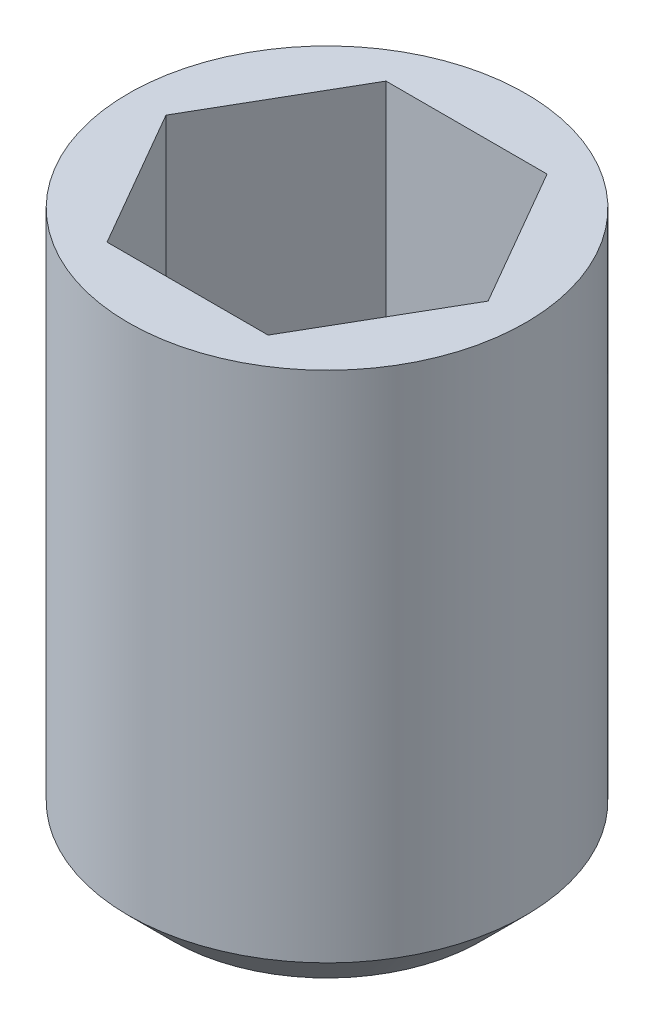
ISO-10303-21;
HEADER;
FILE_DESCRIPTION(('STEP AP214'),'2;1');
FILE_NAME('part.step','',(''),(''),'','','');
FILE_SCHEMA(('AUTOMOTIVE_DESIGN { 1 0 10303 214 1 1 1 1 }'));
ENDSEC;
DATA;
#1=APPLICATION_CONTEXT('core data for automotive mechanical design processes');
#2=APPLICATION_PROTOCOL_DEFINITION('international standard','automotive_design',2000,#1);
#3=PRODUCT_CONTEXT('',#1,'mechanical');
#4=PRODUCT('Part','Part','',(#3));
#5=PRODUCT_RELATED_PRODUCT_CATEGORY('part','',(#4));
#6=PRODUCT_DEFINITION_FORMATION('','',#4);
#7=PRODUCT_DEFINITION_CONTEXT('part definition',#1,'design');
#8=PRODUCT_DEFINITION('design','',#6,#7);
#9=PRODUCT_DEFINITION_SHAPE('','',#8);
#10=(LENGTH_UNIT() NAMED_UNIT(*) SI_UNIT(.MILLI.,.METRE.));
#11=(NAMED_UNIT(*) PLANE_ANGLE_UNIT() SI_UNIT($,.RADIAN.));
#12=(NAMED_UNIT(*) SI_UNIT($,.STERADIAN.) SOLID_ANGLE_UNIT());
#13=UNCERTAINTY_MEASURE_WITH_UNIT(LENGTH_MEASURE(1.E-05),#10,'distance_accuracy_value','');
#14=(GEOMETRIC_REPRESENTATION_CONTEXT(3) GLOBAL_UNCERTAINTY_ASSIGNED_CONTEXT((#13)) GLOBAL_UNIT_ASSIGNED_CONTEXT((#10,
#11,#12)) REPRESENTATION_CONTEXT('',''));
#15=CARTESIAN_POINT('',(0.,0.,0.));
#16=DIRECTION('',(0.,0.,1.));
#17=DIRECTION('',(1.,0.,0.));
#18=AXIS2_PLACEMENT_3D('',#15,#16,#17);
#19=CARTESIAN_POINT('',(0.,-3.175,0.));
#20=DIRECTION('',(0.,1.,0.));
#21=DIRECTION('',(0.,0.,1.));
#22=AXIS2_PLACEMENT_3D('',#19,#20,#21);
#23=CYLINDRICAL_SURFACE('',#22,1.1303);
#24=CARTESIAN_POINT('',(0.,-2.921,0.));
#25=DIRECTION('',(0.,1.,0.));
#26=DIRECTION('',(0.,0.,1.));
#27=AXIS2_PLACEMENT_3D('',#24,#25,#26);
#28=CIRCLE('',#27,1.1303);
#29=CARTESIAN_POINT('',(0.,-2.921,1.1303));
#30=VERTEX_POINT('',#29);
#31=EDGE_CURVE('E40',#30,#30,#28,.T.);
#32=ORIENTED_EDGE('',*,*,#31,.T.);
#33=EDGE_LOOP('',(#32));
#34=FACE_BOUND('',#33,.T.);
#35=CARTESIAN_POINT('',(0.,0.,0.));
#36=DIRECTION('',(0.,1.,0.));
#37=DIRECTION('',(0.,0.,1.));
#38=AXIS2_PLACEMENT_3D('',#35,#36,#37);
#39=CIRCLE('',#38,1.1303);
#40=CARTESIAN_POINT('',(0.,0.,1.1303));
#41=VERTEX_POINT('',#40);
#42=EDGE_CURVE('E134',#41,#41,#39,.T.);
#43=ORIENTED_EDGE('',*,*,#42,.F.);
#44=EDGE_LOOP('',(#43));
#45=FACE_BOUND('',#44,.T.);
#46=ADVANCED_FACE('F32',(#34,#45),#23,.T.);
#47=CARTESIAN_POINT('',(0.,-3.175,0.));
#48=DIRECTION('',(0.,1.,0.));
#49=DIRECTION('',(0.,0.,1.));
#50=AXIS2_PLACEMENT_3D('',#47,#48,#49);
#51=PLANE('',#50);
#52=CARTESIAN_POINT('',(0.,-3.175,0.));
#53=DIRECTION('',(0.,1.,0.));
#54=DIRECTION('',(0.,0.,1.));
#55=AXIS2_PLACEMENT_3D('',#52,#53,#54);
#56=CIRCLE('',#55,0.876299999999999);
#57=CARTESIAN_POINT('',(0.,-3.175,0.876299999999999));
#58=VERTEX_POINT('',#57);
#59=EDGE_CURVE('E11',#58,#58,#56,.F.);
#60=ORIENTED_EDGE('',*,*,#59,.T.);
#61=EDGE_LOOP('',(#60));
#62=FACE_BOUND('',#61,.T.);
#63=ADVANCED_FACE('F156',(#62),#51,.F.);
#64=CARTESIAN_POINT('',(0.,0.,0.));
#65=DIRECTION('',(0.,1.,0.));
#66=DIRECTION('',(0.,0.,1.));
#67=AXIS2_PLACEMENT_3D('',#64,#65,#66);
#68=PLANE('',#67);
#69=DIRECTION('',(-0.5,0.,0.866025403784439));
#70=VECTOR('',#69,1.);
#71=CARTESIAN_POINT('',(-0.458271776169265,0.,-0.79375));
#72=LINE('',#71,#70);
#73=CARTESIAN_POINT('',(-0.458271776169265,0.,-0.79375));
#74=VERTEX_POINT('',#73);
#75=CARTESIAN_POINT('',(-0.91654355233853,0.,0.));
#76=VERTEX_POINT('',#75);
#77=EDGE_CURVE('E47',#74,#76,#72,.T.);
#78=ORIENTED_EDGE('',*,*,#77,.F.);
#79=DIRECTION('',(-1.,0.,0.));
#80=VECTOR('',#79,1.);
#81=CARTESIAN_POINT('',(0.458271776169266,0.,-0.79375));
#82=LINE('',#81,#80);
#83=CARTESIAN_POINT('',(0.458271776169266,0.,-0.79375));
#84=VERTEX_POINT('',#83);
#85=EDGE_CURVE('E130',#84,#74,#82,.T.);
#86=ORIENTED_EDGE('',*,*,#85,.F.);
#87=DIRECTION('',(-0.5,0.,-0.866025403784439));
#88=VECTOR('',#87,1.);
#89=CARTESIAN_POINT('',(0.916543552338531,0.,0.));
#90=LINE('',#89,#88);
#91=CARTESIAN_POINT('',(0.916543552338531,0.,0.));
#92=VERTEX_POINT('',#91);
#93=EDGE_CURVE('E128',#92,#84,#90,.T.);
#94=ORIENTED_EDGE('',*,*,#93,.F.);
#95=DIRECTION('',(0.5,0.,-0.866025403784439));
#96=VECTOR('',#95,1.);
#97=CARTESIAN_POINT('',(0.458271776169265,0.,0.79375));
#98=LINE('',#97,#96);
#99=CARTESIAN_POINT('',(0.458271776169265,0.,0.79375));
#100=VERTEX_POINT('',#99);
#101=EDGE_CURVE('E95',#100,#92,#98,.T.);
#102=ORIENTED_EDGE('',*,*,#101,.F.);
#103=DIRECTION('',(1.,0.,0.));
#104=VECTOR('',#103,1.);
#105=CARTESIAN_POINT('',(-0.458271776169266,0.,0.79375));
#106=LINE('',#105,#104);
#107=CARTESIAN_POINT('',(-0.458271776169266,0.,0.79375));
#108=VERTEX_POINT('',#107);
#109=EDGE_CURVE('E124',#108,#100,#106,.T.);
#110=ORIENTED_EDGE('',*,*,#109,.F.);
#111=DIRECTION('',(0.5,0.,0.866025403784439));
#112=VECTOR('',#111,1.);
#113=CARTESIAN_POINT('',(-0.916543552338531,0.,0.));
#114=LINE('',#113,#112);
#115=EDGE_CURVE('E121',#76,#108,#114,.T.);
#116=ORIENTED_EDGE('',*,*,#115,.F.);
#117=EDGE_LOOP('',(#78,#86,#94,#102,#110,#116));
#118=FACE_BOUND('',#117,.T.);
#119=ORIENTED_EDGE('',*,*,#42,.T.);
#120=EDGE_LOOP('',(#119));
#121=FACE_BOUND('',#120,.T.);
#122=ADVANCED_FACE('F148',(#118,#121),#68,.T.);
#123=CARTESIAN_POINT('',(0.,-2.921,0.));
#124=DIRECTION('',(0.,1.,0.));
#125=DIRECTION('',(0.,0.,1.));
#126=AXIS2_PLACEMENT_3D('',#123,#124,#125);
#127=CONICAL_SURFACE('',#126,1.1303,0.785398163397449);
#128=ORIENTED_EDGE('',*,*,#59,.F.);
#129=EDGE_LOOP('',(#128));
#130=FACE_BOUND('',#129,.T.);
#131=ORIENTED_EDGE('',*,*,#31,.F.);
#132=EDGE_LOOP('',(#131));
#133=FACE_BOUND('',#132,.T.);
#134=ADVANCED_FACE('F34',(#130,#133),#127,.T.);
#135=CARTESIAN_POINT('',(-0.458271776169265,-1.27,-0.79375));
#136=DIRECTION('',(-0.866025403784439,0.,-0.5));
#137=DIRECTION('',(-0.5,0.,0.866025403784439));
#138=AXIS2_PLACEMENT_3D('',#135,#136,#137);
#139=PLANE('',#138);
#140=ORIENTED_EDGE('',*,*,#77,.T.);
#141=DIRECTION('',(0.,1.,0.));
#142=VECTOR('',#141,1.);
#143=CARTESIAN_POINT('',(-0.916543552338531,-1.27,0.));
#144=LINE('',#143,#142);
#145=CARTESIAN_POINT('',(-0.916543552338531,-1.27,0.));
#146=VERTEX_POINT('',#145);
#147=EDGE_CURVE('E77',#146,#76,#144,.T.);
#148=ORIENTED_EDGE('',*,*,#147,.F.);
#149=DIRECTION('',(-0.5,0.,0.866025403784439));
#150=VECTOR('',#149,1.);
#151=CARTESIAN_POINT('',(-0.458271776169265,-1.27,-0.79375));
#152=LINE('',#151,#150);
#153=CARTESIAN_POINT('',(-0.458271776169265,-1.27,-0.79375));
#154=VERTEX_POINT('',#153);
#155=EDGE_CURVE('E132',#154,#146,#152,.T.);
#156=ORIENTED_EDGE('',*,*,#155,.F.);
#157=DIRECTION('',(0.,1.,0.));
#158=VECTOR('',#157,1.);
#159=CARTESIAN_POINT('',(-0.458271776169265,-1.27,-0.79375));
#160=LINE('',#159,#158);
#161=EDGE_CURVE('E55',#154,#74,#160,.T.);
#162=ORIENTED_EDGE('',*,*,#161,.T.);
#163=EDGE_LOOP('',(#140,#148,#156,#162));
#164=FACE_BOUND('',#163,.T.);
#165=ADVANCED_FACE('F147',(#164),#139,.F.);
#166=CARTESIAN_POINT('',(0.458271776169266,-1.27,-0.79375));
#167=DIRECTION('',(0.,0.,-1.));
#168=DIRECTION('',(-1.,0.,0.));
#169=AXIS2_PLACEMENT_3D('',#166,#167,#168);
#170=PLANE('',#169);
#171=ORIENTED_EDGE('',*,*,#85,.T.);
#172=ORIENTED_EDGE('',*,*,#161,.F.);
#173=DIRECTION('',(-1.,0.,0.));
#174=VECTOR('',#173,1.);
#175=CARTESIAN_POINT('',(0.458271776169266,-1.27,-0.79375));
#176=LINE('',#175,#174);
#177=CARTESIAN_POINT('',(0.458271776169266,-1.27,-0.79375));
#178=VERTEX_POINT('',#177);
#179=EDGE_CURVE('E107',#178,#154,#176,.T.);
#180=ORIENTED_EDGE('',*,*,#179,.F.);
#181=DIRECTION('',(0.,1.,0.));
#182=VECTOR('',#181,1.);
#183=CARTESIAN_POINT('',(0.458271776169266,-1.27,-0.79375));
#184=LINE('',#183,#182);
#185=EDGE_CURVE('E99',#178,#84,#184,.T.);
#186=ORIENTED_EDGE('',*,*,#185,.T.);
#187=EDGE_LOOP('',(#171,#172,#180,#186));
#188=FACE_BOUND('',#187,.T.);
#189=ADVANCED_FACE('F154',(#188),#170,.F.);
#190=CARTESIAN_POINT('',(0.916543552338531,-1.27,0.));
#191=DIRECTION('',(0.866025403784439,0.,-0.5));
#192=DIRECTION('',(-0.5,0.,-0.866025403784439));
#193=AXIS2_PLACEMENT_3D('',#190,#191,#192);
#194=PLANE('',#193);
#195=ORIENTED_EDGE('',*,*,#93,.T.);
#196=ORIENTED_EDGE('',*,*,#185,.F.);
#197=DIRECTION('',(-0.5,0.,-0.866025403784439));
#198=VECTOR('',#197,1.);
#199=CARTESIAN_POINT('',(0.916543552338531,-1.27,0.));
#200=LINE('',#199,#198);
#201=CARTESIAN_POINT('',(0.916543552338531,-1.27,0.));
#202=VERTEX_POINT('',#201);
#203=EDGE_CURVE('E103',#202,#178,#200,.T.);
#204=ORIENTED_EDGE('',*,*,#203,.F.);
#205=DIRECTION('',(0.,1.,0.));
#206=VECTOR('',#205,1.);
#207=CARTESIAN_POINT('',(0.916543552338531,-1.27,0.));
#208=LINE('',#207,#206);
#209=EDGE_CURVE('E88',#202,#92,#208,.T.);
#210=ORIENTED_EDGE('',*,*,#209,.T.);
#211=EDGE_LOOP('',(#195,#196,#204,#210));
#212=FACE_BOUND('',#211,.T.);
#213=ADVANCED_FACE('F104',(#212),#194,.F.);
#214=CARTESIAN_POINT('',(0.458271776169265,-1.27,0.79375));
#215=DIRECTION('',(0.866025403784439,0.,0.5));
#216=DIRECTION('',(0.5,0.,-0.866025403784439));
#217=AXIS2_PLACEMENT_3D('',#214,#215,#216);
#218=PLANE('',#217);
#219=ORIENTED_EDGE('',*,*,#101,.T.);
#220=ORIENTED_EDGE('',*,*,#209,.F.);
#221=DIRECTION('',(0.5,0.,-0.866025403784439));
#222=VECTOR('',#221,1.);
#223=CARTESIAN_POINT('',(0.458271776169265,-1.27,0.79375));
#224=LINE('',#223,#222);
#225=CARTESIAN_POINT('',(0.458271776169265,-1.27,0.79375));
#226=VERTEX_POINT('',#225);
#227=EDGE_CURVE('E92',#226,#202,#224,.T.);
#228=ORIENTED_EDGE('',*,*,#227,.F.);
#229=DIRECTION('',(0.,1.,0.));
#230=VECTOR('',#229,1.);
#231=CARTESIAN_POINT('',(0.458271776169265,-1.27,0.79375));
#232=LINE('',#231,#230);
#233=EDGE_CURVE('E100',#226,#100,#232,.T.);
#234=ORIENTED_EDGE('',*,*,#233,.T.);
#235=EDGE_LOOP('',(#219,#220,#228,#234));
#236=FACE_BOUND('',#235,.T.);
#237=ADVANCED_FACE('F90',(#236),#218,.F.);
#238=CARTESIAN_POINT('',(-0.458271776169266,-1.27,0.79375));
#239=DIRECTION('',(0.,0.,1.));
#240=DIRECTION('',(1.,0.,0.));
#241=AXIS2_PLACEMENT_3D('',#238,#239,#240);
#242=PLANE('',#241);
#243=ORIENTED_EDGE('',*,*,#109,.T.);
#244=ORIENTED_EDGE('',*,*,#233,.F.);
#245=DIRECTION('',(1.,0.,0.));
#246=VECTOR('',#245,1.);
#247=CARTESIAN_POINT('',(-0.458271776169266,-1.27,0.79375));
#248=LINE('',#247,#246);
#249=CARTESIAN_POINT('',(-0.458271776169266,-1.27,0.79375));
#250=VERTEX_POINT('',#249);
#251=EDGE_CURVE('E113',#250,#226,#248,.T.);
#252=ORIENTED_EDGE('',*,*,#251,.F.);
#253=DIRECTION('',(0.,1.,0.));
#254=VECTOR('',#253,1.);
#255=CARTESIAN_POINT('',(-0.458271776169266,-1.27,0.79375));
#256=LINE('',#255,#254);
#257=EDGE_CURVE('E137',#250,#108,#256,.T.);
#258=ORIENTED_EDGE('',*,*,#257,.T.);
#259=EDGE_LOOP('',(#243,#244,#252,#258));
#260=FACE_BOUND('',#259,.T.);
#261=ADVANCED_FACE('F170',(#260),#242,.F.);
#262=CARTESIAN_POINT('',(-0.916543552338531,-1.27,0.));
#263=DIRECTION('',(-0.866025403784439,0.,0.5));
#264=DIRECTION('',(0.5,0.,0.866025403784439));
#265=AXIS2_PLACEMENT_3D('',#262,#263,#264);
#266=PLANE('',#265);
#267=ORIENTED_EDGE('',*,*,#115,.T.);
#268=ORIENTED_EDGE('',*,*,#257,.F.);
#269=DIRECTION('',(0.5,0.,0.866025403784439));
#270=VECTOR('',#269,1.);
#271=CARTESIAN_POINT('',(-0.916543552338531,-1.27,0.));
#272=LINE('',#271,#270);
#273=EDGE_CURVE('E115',#146,#250,#272,.T.);
#274=ORIENTED_EDGE('',*,*,#273,.F.);
#275=ORIENTED_EDGE('',*,*,#147,.T.);
#276=EDGE_LOOP('',(#267,#268,#274,#275));
#277=FACE_BOUND('',#276,.T.);
#278=ADVANCED_FACE('F167',(#277),#266,.F.);
#279=CARTESIAN_POINT('',(0.,-1.27,0.));
#280=DIRECTION('',(0.,1.,0.));
#281=DIRECTION('',(0.,0.,1.));
#282=AXIS2_PLACEMENT_3D('',#279,#280,#281);
#283=PLANE('',#282);
#284=ORIENTED_EDGE('',*,*,#155,.T.);
#285=ORIENTED_EDGE('',*,*,#273,.T.);
#286=ORIENTED_EDGE('',*,*,#251,.T.);
#287=ORIENTED_EDGE('',*,*,#227,.T.);
#288=ORIENTED_EDGE('',*,*,#203,.T.);
#289=ORIENTED_EDGE('',*,*,#179,.T.);
#290=EDGE_LOOP('',(#284,#285,#286,#287,#288,#289));
#291=FACE_BOUND('',#290,.T.);
#292=ADVANCED_FACE('F110',(#291),#283,.T.);
#293=CLOSED_SHELL('',(#46,#63,#122,#134,#165,#189,#213,#237,#261,#278,#292));
#294=MANIFOLD_SOLID_BREP('B2',#293);
#295=ADVANCED_BREP_SHAPE_REPRESENTATION('',(#18,#294),#14);
#296=SHAPE_DEFINITION_REPRESENTATION(#9,#295);
ENDSEC;
END-ISO-10303-21;
